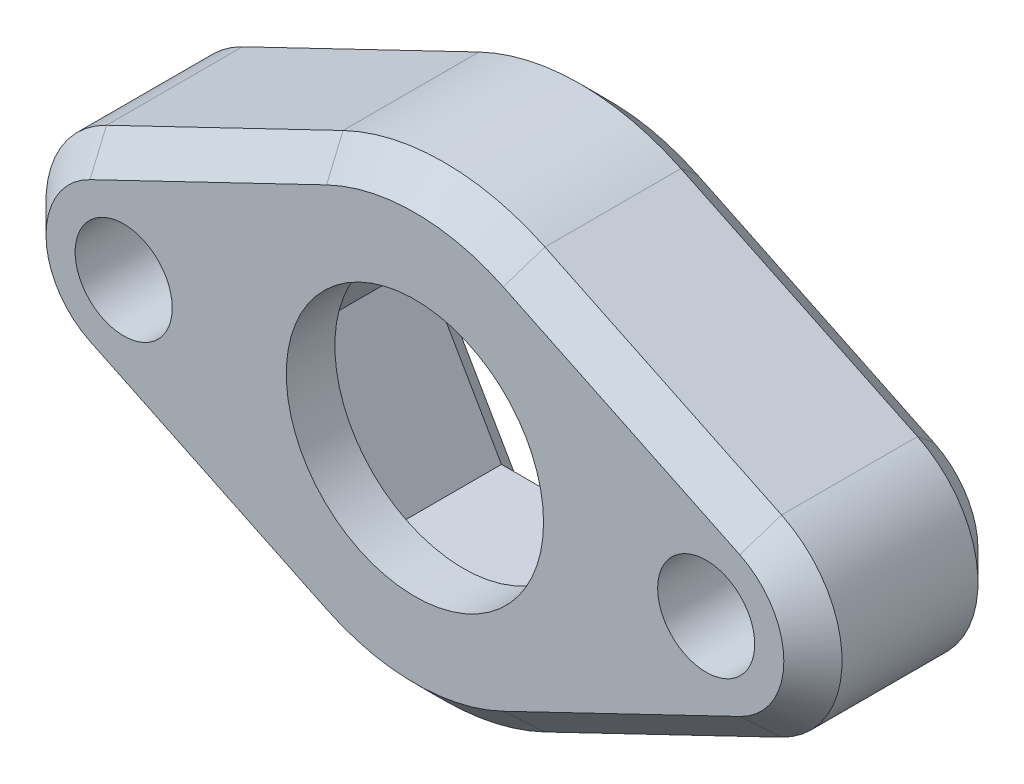
ISO-10303-21;
HEADER;
FILE_DESCRIPTION(('STEP AP214'),'2;1');
FILE_NAME('part.step','',(''),(''),'','','');
FILE_SCHEMA(('AUTOMOTIVE_DESIGN { 1 0 10303 214 1 1 1 1 }'));
ENDSEC;
DATA;
#1=APPLICATION_CONTEXT('core data for automotive mechanical design processes');
#2=APPLICATION_PROTOCOL_DEFINITION('international standard','automotive_design',2000,#1);
#3=PRODUCT_CONTEXT('',#1,'mechanical');
#4=PRODUCT('Part','Part','',(#3));
#5=PRODUCT_RELATED_PRODUCT_CATEGORY('part','',(#4));
#6=PRODUCT_DEFINITION_FORMATION('','',#4);
#7=PRODUCT_DEFINITION_CONTEXT('part definition',#1,'design');
#8=PRODUCT_DEFINITION('design','',#6,#7);
#9=PRODUCT_DEFINITION_SHAPE('','',#8);
#10=(LENGTH_UNIT() NAMED_UNIT(*) SI_UNIT(.MILLI.,.METRE.));
#11=(NAMED_UNIT(*) PLANE_ANGLE_UNIT() SI_UNIT($,.RADIAN.));
#12=(NAMED_UNIT(*) SI_UNIT($,.STERADIAN.) SOLID_ANGLE_UNIT());
#13=UNCERTAINTY_MEASURE_WITH_UNIT(LENGTH_MEASURE(1.E-05),#10,'distance_accuracy_value','');
#14=(GEOMETRIC_REPRESENTATION_CONTEXT(3) GLOBAL_UNCERTAINTY_ASSIGNED_CONTEXT((#13)) GLOBAL_UNIT_ASSIGNED_CONTEXT((#10,
#11,#12)) REPRESENTATION_CONTEXT('',''));
#15=CARTESIAN_POINT('',(0.,0.,0.));
#16=DIRECTION('',(0.,0.,1.));
#17=DIRECTION('',(1.,0.,0.));
#18=AXIS2_PLACEMENT_3D('',#15,#16,#17);
#19=CARTESIAN_POINT('',(4.04145188432738,-7.,10.));
#20=DIRECTION('',(-0.866025403784439,0.5,0.));
#21=DIRECTION('',(-0.5,-0.866025403784439,0.));
#22=AXIS2_PLACEMENT_3D('',#19,#20,#21);
#23=PLANE('',#22);
#24=DIRECTION('',(0.,0.,-1.));
#25=VECTOR('',#24,1.);
#26=CARTESIAN_POINT('',(8.08290376865476,0.,10.));
#27=LINE('',#26,#25);
#28=CARTESIAN_POINT('',(8.08290376865476,0.,7.5));
#29=VERTEX_POINT('',#28);
#30=CARTESIAN_POINT('',(8.08290376865476,0.,1.50000000000001));
#31=VERTEX_POINT('',#30);
#32=EDGE_CURVE('E227',#29,#31,#27,.T.);
#33=ORIENTED_EDGE('',*,*,#32,.T.);
#34=DIRECTION('',(-0.5,-0.866025403784439,0.));
#35=VECTOR('',#34,1.);
#36=CARTESIAN_POINT('',(4.04145188432738,-7.,1.50000000000001));
#37=LINE('',#36,#35);
#38=CARTESIAN_POINT('',(4.04145188432738,-7.,1.50000000000001));
#39=VERTEX_POINT('',#38);
#40=EDGE_CURVE('E356',#31,#39,#37,.T.);
#41=ORIENTED_EDGE('',*,*,#40,.T.);
#42=DIRECTION('',(0.,0.,-1.));
#43=VECTOR('',#42,1.);
#44=CARTESIAN_POINT('',(4.04145188432738,-7.,10.));
#45=LINE('',#44,#43);
#46=CARTESIAN_POINT('',(4.04145188432738,-7.,7.5));
#47=VERTEX_POINT('',#46);
#48=EDGE_CURVE('E229',#47,#39,#45,.T.);
#49=ORIENTED_EDGE('',*,*,#48,.F.);
#50=DIRECTION('',(0.5,0.866025403784439,0.));
#51=VECTOR('',#50,1.);
#52=CARTESIAN_POINT('',(4.04145188432738,-7.,7.5));
#53=LINE('',#52,#51);
#54=EDGE_CURVE('E215',#47,#29,#53,.T.);
#55=ORIENTED_EDGE('',*,*,#54,.T.);
#56=EDGE_LOOP('',(#33,#41,#49,#55));
#57=FACE_BOUND('',#56,.T.);
#58=ADVANCED_FACE('F41',(#57),#23,.T.);
#59=CARTESIAN_POINT('',(8.08290376865476,0.,10.));
#60=DIRECTION('',(-0.866025403784438,-0.5,0.));
#61=DIRECTION('',(0.5,-0.866025403784438,0.));
#62=AXIS2_PLACEMENT_3D('',#59,#60,#61);
#63=PLANE('',#62);
#64=DIRECTION('',(0.,0.,-1.));
#65=VECTOR('',#64,1.);
#66=CARTESIAN_POINT('',(4.04145188432738,7.,10.));
#67=LINE('',#66,#65);
#68=CARTESIAN_POINT('',(4.04145188432738,7.,7.5));
#69=VERTEX_POINT('',#68);
#70=CARTESIAN_POINT('',(4.04145188432738,7.,1.50000000000001));
#71=VERTEX_POINT('',#70);
#72=EDGE_CURVE('E237',#69,#71,#67,.T.);
#73=ORIENTED_EDGE('',*,*,#72,.T.);
#74=DIRECTION('',(0.5,-0.866025403784438,0.));
#75=VECTOR('',#74,1.);
#76=CARTESIAN_POINT('',(8.08290376865476,0.,1.50000000000001));
#77=LINE('',#76,#75);
#78=EDGE_CURVE('E235',#71,#31,#77,.T.);
#79=ORIENTED_EDGE('',*,*,#78,.T.);
#80=ORIENTED_EDGE('',*,*,#32,.F.);
#81=DIRECTION('',(-0.5,0.866025403784438,0.));
#82=VECTOR('',#81,1.);
#83=CARTESIAN_POINT('',(8.08290376865476,0.,7.5));
#84=LINE('',#83,#82);
#85=EDGE_CURVE('E211',#29,#69,#84,.T.);
#86=ORIENTED_EDGE('',*,*,#85,.T.);
#87=EDGE_LOOP('',(#73,#79,#80,#86));
#88=FACE_BOUND('',#87,.T.);
#89=ADVANCED_FACE('F233',(#88),#63,.T.);
#90=CARTESIAN_POINT('',(4.04145188432738,7.,10.));
#91=DIRECTION('',(0.,-1.,0.));
#92=DIRECTION('',(0.,0.,-1.));
#93=AXIS2_PLACEMENT_3D('',#90,#91,#92);
#94=PLANE('',#93);
#95=DIRECTION('',(0.,0.,-1.));
#96=VECTOR('',#95,1.);
#97=CARTESIAN_POINT('',(-4.04145188432738,7.,10.));
#98=LINE('',#97,#96);
#99=CARTESIAN_POINT('',(-4.04145188432738,7.,7.5));
#100=VERTEX_POINT('',#99);
#101=CARTESIAN_POINT('',(-4.04145188432738,7.,1.50000000000001));
#102=VERTEX_POINT('',#101);
#103=EDGE_CURVE('E242',#100,#102,#98,.T.);
#104=ORIENTED_EDGE('',*,*,#103,.T.);
#105=DIRECTION('',(1.,0.,0.));
#106=VECTOR('',#105,1.);
#107=CARTESIAN_POINT('',(4.04145188432738,7.,1.50000000000001));
#108=LINE('',#107,#106);
#109=EDGE_CURVE('E11',#102,#71,#108,.T.);
#110=ORIENTED_EDGE('',*,*,#109,.T.);
#111=ORIENTED_EDGE('',*,*,#72,.F.);
#112=DIRECTION('',(-1.,0.,0.));
#113=VECTOR('',#112,1.);
#114=CARTESIAN_POINT('',(4.04145188432738,7.,7.5));
#115=LINE('',#114,#113);
#116=EDGE_CURVE('E218',#69,#100,#115,.T.);
#117=ORIENTED_EDGE('',*,*,#116,.T.);
#118=EDGE_LOOP('',(#104,#110,#111,#117));
#119=FACE_BOUND('',#118,.T.);
#120=ADVANCED_FACE('F538',(#119),#94,.T.);
#121=CARTESIAN_POINT('',(-4.04145188432738,7.,10.));
#122=DIRECTION('',(0.866025403784439,-0.5,0.));
#123=DIRECTION('',(0.5,0.866025403784439,0.));
#124=AXIS2_PLACEMENT_3D('',#121,#122,#123);
#125=PLANE('',#124);
#126=DIRECTION('',(0.,0.,-1.));
#127=VECTOR('',#126,1.);
#128=CARTESIAN_POINT('',(-8.08290376865476,0.,10.));
#129=LINE('',#128,#127);
#130=CARTESIAN_POINT('',(-8.08290376865476,0.,7.5));
#131=VERTEX_POINT('',#130);
#132=CARTESIAN_POINT('',(-8.08290376865476,0.,1.50000000000001));
#133=VERTEX_POINT('',#132);
#134=EDGE_CURVE('E675',#131,#133,#129,.T.);
#135=ORIENTED_EDGE('',*,*,#134,.T.);
#136=DIRECTION('',(0.5,0.866025403784439,0.));
#137=VECTOR('',#136,1.);
#138=CARTESIAN_POINT('',(-4.04145188432738,7.,1.50000000000001));
#139=LINE('',#138,#137);
#140=EDGE_CURVE('E51',#133,#102,#139,.T.);
#141=ORIENTED_EDGE('',*,*,#140,.T.);
#142=ORIENTED_EDGE('',*,*,#103,.F.);
#143=DIRECTION('',(-0.5,-0.866025403784439,0.));
#144=VECTOR('',#143,1.);
#145=CARTESIAN_POINT('',(-4.04145188432738,7.,7.5));
#146=LINE('',#145,#144);
#147=EDGE_CURVE('E683',#100,#131,#146,.T.);
#148=ORIENTED_EDGE('',*,*,#147,.T.);
#149=EDGE_LOOP('',(#135,#141,#142,#148));
#150=FACE_BOUND('',#149,.T.);
#151=ADVANCED_FACE('F682',(#150),#125,.T.);
#152=CARTESIAN_POINT('',(-8.08290376865476,0.,10.));
#153=DIRECTION('',(0.866025403784438,0.5,0.));
#154=DIRECTION('',(-0.5,0.866025403784438,0.));
#155=AXIS2_PLACEMENT_3D('',#152,#153,#154);
#156=PLANE('',#155);
#157=DIRECTION('',(0.,0.,-1.));
#158=VECTOR('',#157,1.);
#159=CARTESIAN_POINT('',(-4.04145188432738,-7.,10.));
#160=LINE('',#159,#158);
#161=CARTESIAN_POINT('',(-4.04145188432738,-7.,7.5));
#162=VERTEX_POINT('',#161);
#163=CARTESIAN_POINT('',(-4.04145188432738,-7.,1.50000000000001));
#164=VERTEX_POINT('',#163);
#165=EDGE_CURVE('E671',#162,#164,#160,.T.);
#166=ORIENTED_EDGE('',*,*,#165,.T.);
#167=DIRECTION('',(-0.5,0.866025403784438,0.));
#168=VECTOR('',#167,1.);
#169=CARTESIAN_POINT('',(-8.08290376865476,0.,1.50000000000001));
#170=LINE('',#169,#168);
#171=EDGE_CURVE('E66',#164,#133,#170,.T.);
#172=ORIENTED_EDGE('',*,*,#171,.T.);
#173=ORIENTED_EDGE('',*,*,#134,.F.);
#174=DIRECTION('',(0.5,-0.866025403784438,0.));
#175=VECTOR('',#174,1.);
#176=CARTESIAN_POINT('',(-8.08290376865476,0.,7.5));
#177=LINE('',#176,#175);
#178=EDGE_CURVE('E686',#131,#162,#177,.T.);
#179=ORIENTED_EDGE('',*,*,#178,.T.);
#180=EDGE_LOOP('',(#166,#172,#173,#179));
#181=FACE_BOUND('',#180,.T.);
#182=ADVANCED_FACE('F685',(#181),#156,.T.);
#183=CARTESIAN_POINT('',(-4.04145188432738,-7.,10.));
#184=DIRECTION('',(0.,1.,0.));
#185=DIRECTION('',(-1.,0.,0.));
#186=AXIS2_PLACEMENT_3D('',#183,#184,#185);
#187=PLANE('',#186);
#188=ORIENTED_EDGE('',*,*,#48,.T.);
#189=DIRECTION('',(-1.,0.,0.));
#190=VECTOR('',#189,1.);
#191=CARTESIAN_POINT('',(-4.04145188432738,-7.,1.50000000000001));
#192=LINE('',#191,#190);
#193=EDGE_CURVE('E358',#39,#164,#192,.T.);
#194=ORIENTED_EDGE('',*,*,#193,.T.);
#195=ORIENTED_EDGE('',*,*,#165,.F.);
#196=DIRECTION('',(1.,0.,0.));
#197=VECTOR('',#196,1.);
#198=CARTESIAN_POINT('',(-4.04145188432738,-7.,7.5));
#199=LINE('',#198,#197);
#200=EDGE_CURVE('E272',#162,#47,#199,.T.);
#201=ORIENTED_EDGE('',*,*,#200,.T.);
#202=EDGE_LOOP('',(#188,#194,#195,#201));
#203=FACE_BOUND('',#202,.T.);
#204=ADVANCED_FACE('F550',(#203),#187,.T.);
#205=CARTESIAN_POINT('',(0.,0.,10.));
#206=DIRECTION('',(0.,0.,1.));
#207=DIRECTION('',(1.,0.,0.));
#208=AXIS2_PLACEMENT_3D('',#205,#206,#207);
#209=PLANE('',#208);
#210=DIRECTION('',(0.901233722306385,0.433333333333333,0.));
#211=VECTOR('',#210,1.);
#212=CARTESIAN_POINT('',(16.7333333333333,-3.60493488922554,10.));
#213=LINE('',#212,#211);
#214=CARTESIAN_POINT('',(4.55000000000001,-9.46295408421704,10.));
#215=VERTEX_POINT('',#214);
#216=CARTESIAN_POINT('',(16.7333333333333,-3.60493488922554,10.));
#217=VERTEX_POINT('',#216);
#218=EDGE_CURVE('E284',#215,#217,#213,.T.);
#219=ORIENTED_EDGE('',*,*,#218,.T.);
#220=CARTESIAN_POINT('',(15.,0.,10.));
#221=DIRECTION('',(0.,0.,1.));
#222=DIRECTION('',(1.,0.,0.));
#223=AXIS2_PLACEMENT_3D('',#220,#221,#222);
#224=CIRCLE('',#223,4.);
#225=CARTESIAN_POINT('',(16.7333333333333,3.60493488922554,10.));
#226=VERTEX_POINT('',#225);
#227=EDGE_CURVE('E288',#217,#226,#224,.T.);
#228=ORIENTED_EDGE('',*,*,#227,.T.);
#229=DIRECTION('',(-0.901233722306385,0.433333333333333,0.));
#230=VECTOR('',#229,1.);
#231=CARTESIAN_POINT('',(4.55,9.46295408421704,10.));
#232=LINE('',#231,#230);
#233=CARTESIAN_POINT('',(4.55,9.46295408421704,10.));
#234=VERTEX_POINT('',#233);
#235=EDGE_CURVE('E286',#226,#234,#232,.T.);
#236=ORIENTED_EDGE('',*,*,#235,.T.);
#237=CARTESIAN_POINT('',(0.,0.,10.));
#238=DIRECTION('',(0.,0.,1.));
#239=DIRECTION('',(1.,0.,0.));
#240=AXIS2_PLACEMENT_3D('',#237,#238,#239);
#241=CIRCLE('',#240,10.5);
#242=CARTESIAN_POINT('',(-4.55,9.46295408421704,10.));
#243=VERTEX_POINT('',#242);
#244=EDGE_CURVE('E282',#234,#243,#241,.T.);
#245=ORIENTED_EDGE('',*,*,#244,.T.);
#246=DIRECTION('',(-0.901233722306385,-0.433333333333333,0.));
#247=VECTOR('',#246,1.);
#248=CARTESIAN_POINT('',(-16.7333333333333,3.60493488922554,10.));
#249=LINE('',#248,#247);
#250=CARTESIAN_POINT('',(-16.7333333333333,3.60493488922554,10.));
#251=VERTEX_POINT('',#250);
#252=EDGE_CURVE('E278',#243,#251,#249,.T.);
#253=ORIENTED_EDGE('',*,*,#252,.T.);
#254=CARTESIAN_POINT('',(-15.,0.,10.));
#255=DIRECTION('',(0.,0.,1.));
#256=DIRECTION('',(1.,0.,0.));
#257=AXIS2_PLACEMENT_3D('',#254,#255,#256);
#258=CIRCLE('',#257,4.);
#259=CARTESIAN_POINT('',(-16.7333333333333,-3.60493488922554,10.));
#260=VERTEX_POINT('',#259);
#261=EDGE_CURVE('E274',#251,#260,#258,.T.);
#262=ORIENTED_EDGE('',*,*,#261,.T.);
#263=DIRECTION('',(0.901233722306385,-0.433333333333333,0.));
#264=VECTOR('',#263,1.);
#265=CARTESIAN_POINT('',(-4.55,-9.46295408421704,10.));
#266=LINE('',#265,#264);
#267=CARTESIAN_POINT('',(-4.55,-9.46295408421704,10.));
#268=VERTEX_POINT('',#267);
#269=EDGE_CURVE('E276',#260,#268,#266,.T.);
#270=ORIENTED_EDGE('',*,*,#269,.T.);
#271=CARTESIAN_POINT('',(0.,0.,10.));
#272=DIRECTION('',(0.,0.,1.));
#273=DIRECTION('',(1.,0.,0.));
#274=AXIS2_PLACEMENT_3D('',#271,#272,#273);
#275=CIRCLE('',#274,10.5);
#276=EDGE_CURVE('E280',#268,#215,#275,.T.);
#277=ORIENTED_EDGE('',*,*,#276,.T.);
#278=EDGE_LOOP('',(#219,#228,#236,#245,#253,#262,#270,#277));
#279=FACE_BOUND('',#278,.T.);
#280=CARTESIAN_POINT('',(-15.,0.,10.));
#281=DIRECTION('',(0.,0.,1.));
#282=DIRECTION('',(1.,0.,0.));
#283=AXIS2_PLACEMENT_3D('',#280,#281,#282);
#284=CIRCLE('',#283,2.5);
#285=CARTESIAN_POINT('',(-12.5,0.,10.));
#286=VERTEX_POINT('',#285);
#287=EDGE_CURVE('E240',#286,#286,#284,.T.);
#288=ORIENTED_EDGE('',*,*,#287,.F.);
#289=EDGE_LOOP('',(#288));
#290=FACE_BOUND('',#289,.T.);
#291=CARTESIAN_POINT('',(15.,0.,10.));
#292=DIRECTION('',(0.,0.,1.));
#293=DIRECTION('',(-1.,0.,0.));
#294=AXIS2_PLACEMENT_3D('',#291,#292,#293);
#295=CIRCLE('',#294,2.5);
#296=CARTESIAN_POINT('',(12.5,0.,10.));
#297=VERTEX_POINT('',#296);
#298=EDGE_CURVE('E672',#297,#297,#295,.T.);
#299=ORIENTED_EDGE('',*,*,#298,.F.);
#300=EDGE_LOOP('',(#299));
#301=FACE_BOUND('',#300,.T.);
#302=CARTESIAN_POINT('',(0.,0.,10.));
#303=DIRECTION('',(0.,0.,1.));
#304=DIRECTION('',(1.,0.,0.));
#305=AXIS2_PLACEMENT_3D('',#302,#303,#304);
#306=CIRCLE('',#305,6.625);
#307=CARTESIAN_POINT('',(6.625,0.,10.));
#308=VERTEX_POINT('',#307);
#309=EDGE_CURVE('E385',#308,#308,#306,.T.);
#310=ORIENTED_EDGE('',*,*,#309,.F.);
#311=EDGE_LOOP('',(#310));
#312=FACE_BOUND('',#311,.T.);
#313=ADVANCED_FACE('F547',(#279,#290,#301,#312),#209,.T.);
#314=CARTESIAN_POINT('',(0.,0.,0.));
#315=DIRECTION('',(0.,0.,1.));
#316=DIRECTION('',(1.,0.,0.));
#317=AXIS2_PLACEMENT_3D('',#314,#315,#316);
#318=PLANE('',#317);
#319=DIRECTION('',(0.5,0.866025403784439,0.));
#320=VECTOR('',#319,1.);
#321=CARTESIAN_POINT('',(9.38194187433142,-0.750000000000001,0.));
#322=LINE('',#321,#320);
#323=CARTESIAN_POINT('',(4.90747728811182,-8.5,0.));
#324=VERTEX_POINT('',#323);
#325=CARTESIAN_POINT('',(9.81495457622364,0.,0.));
#326=VERTEX_POINT('',#325);
#327=EDGE_CURVE('E350',#324,#326,#322,.T.);
#328=ORIENTED_EDGE('',*,*,#327,.T.);
#329=DIRECTION('',(-0.5,0.866025403784438,0.));
#330=VECTOR('',#329,1.);
#331=CARTESIAN_POINT('',(5.34048999000404,7.75,0.));
#332=LINE('',#331,#330);
#333=CARTESIAN_POINT('',(4.90747728811182,8.5,0.));
#334=VERTEX_POINT('',#333);
#335=EDGE_CURVE('E352',#326,#334,#332,.T.);
#336=ORIENTED_EDGE('',*,*,#335,.T.);
#337=DIRECTION('',(-1.,0.,0.));
#338=VECTOR('',#337,1.);
#339=CARTESIAN_POINT('',(-4.04145188432738,8.5,0.));
#340=LINE('',#339,#338);
#341=CARTESIAN_POINT('',(-4.90747728811182,8.5,0.));
#342=VERTEX_POINT('',#341);
#343=EDGE_CURVE('E342',#334,#342,#340,.T.);
#344=ORIENTED_EDGE('',*,*,#343,.T.);
#345=DIRECTION('',(-0.5,-0.866025403784439,0.));
#346=VECTOR('',#345,1.);
#347=CARTESIAN_POINT('',(-9.38194187433142,0.750000000000003,0.));
#348=LINE('',#347,#346);
#349=CARTESIAN_POINT('',(-9.81495457622364,0.,0.));
#350=VERTEX_POINT('',#349);
#351=EDGE_CURVE('E344',#342,#350,#348,.T.);
#352=ORIENTED_EDGE('',*,*,#351,.T.);
#353=DIRECTION('',(0.5,-0.866025403784439,0.));
#354=VECTOR('',#353,1.);
#355=CARTESIAN_POINT('',(-5.34048999000404,-7.75,0.));
#356=LINE('',#355,#354);
#357=CARTESIAN_POINT('',(-4.90747728811182,-8.5,0.));
#358=VERTEX_POINT('',#357);
#359=EDGE_CURVE('E346',#350,#358,#356,.T.);
#360=ORIENTED_EDGE('',*,*,#359,.T.);
#361=DIRECTION('',(1.,0.,0.));
#362=VECTOR('',#361,1.);
#363=CARTESIAN_POINT('',(4.04145188432738,-8.5,0.));
#364=LINE('',#363,#362);
#365=EDGE_CURVE('E348',#358,#324,#364,.T.);
#366=ORIENTED_EDGE('',*,*,#365,.T.);
#367=EDGE_LOOP('',(#328,#336,#344,#352,#360,#366));
#368=FACE_BOUND('',#367,.T.);
#369=DIRECTION('',(0.901233722306385,0.433333333333333,0.));
#370=VECTOR('',#369,1.);
#371=CARTESIAN_POINT('',(-4.54999999999999,9.46295408421704,0.));
#372=LINE('',#371,#370);
#373=CARTESIAN_POINT('',(-16.7333333333333,3.60493488922553,0.));
#374=VERTEX_POINT('',#373);
#375=CARTESIAN_POINT('',(-4.55,9.46295408421703,0.));
#376=VERTEX_POINT('',#375);
#377=EDGE_CURVE('E337',#374,#376,#372,.T.);
#378=ORIENTED_EDGE('',*,*,#377,.T.);
#379=CARTESIAN_POINT('',(0.,0.,0.));
#380=DIRECTION('',(0.,0.,1.));
#381=DIRECTION('',(1.,0.,0.));
#382=AXIS2_PLACEMENT_3D('',#379,#380,#381);
#383=CIRCLE('',#382,10.5);
#384=CARTESIAN_POINT('',(4.55,9.46295408421704,0.));
#385=VERTEX_POINT('',#384);
#386=EDGE_CURVE('E339',#376,#385,#383,.F.);
#387=ORIENTED_EDGE('',*,*,#386,.T.);
#388=DIRECTION('',(0.901233722306385,-0.433333333333333,0.));
#389=VECTOR('',#388,1.);
#390=CARTESIAN_POINT('',(4.54999999999999,9.46295408421704,0.));
#391=LINE('',#390,#389);
#392=CARTESIAN_POINT('',(16.7333333333333,3.60493488922554,0.));
#393=VERTEX_POINT('',#392);
#394=EDGE_CURVE('E335',#385,#393,#391,.T.);
#395=ORIENTED_EDGE('',*,*,#394,.T.);
#396=CARTESIAN_POINT('',(15.,0.,0.));
#397=DIRECTION('',(0.,0.,1.));
#398=DIRECTION('',(1.,0.,0.));
#399=AXIS2_PLACEMENT_3D('',#396,#397,#398);
#400=CIRCLE('',#399,4.);
#401=CARTESIAN_POINT('',(16.7333333333333,-3.60493488922553,0.));
#402=VERTEX_POINT('',#401);
#403=EDGE_CURVE('E331',#393,#402,#400,.F.);
#404=ORIENTED_EDGE('',*,*,#403,.T.);
#405=DIRECTION('',(-0.901233722306385,-0.433333333333333,0.));
#406=VECTOR('',#405,1.);
#407=CARTESIAN_POINT('',(4.55,-9.46295408421704,0.));
#408=LINE('',#407,#406);
#409=CARTESIAN_POINT('',(4.55,-9.46295408421703,0.));
#410=VERTEX_POINT('',#409);
#411=EDGE_CURVE('E327',#402,#410,#408,.T.);
#412=ORIENTED_EDGE('',*,*,#411,.T.);
#413=CARTESIAN_POINT('',(0.,0.,0.));
#414=DIRECTION('',(0.,0.,1.));
#415=DIRECTION('',(1.,0.,0.));
#416=AXIS2_PLACEMENT_3D('',#413,#414,#415);
#417=CIRCLE('',#416,10.5);
#418=CARTESIAN_POINT('',(-4.55,-9.46295408421704,0.));
#419=VERTEX_POINT('',#418);
#420=EDGE_CURVE('E325',#410,#419,#417,.F.);
#421=ORIENTED_EDGE('',*,*,#420,.T.);
#422=DIRECTION('',(-0.901233722306385,0.433333333333333,0.));
#423=VECTOR('',#422,1.);
#424=CARTESIAN_POINT('',(-4.55,-9.46295408421704,0.));
#425=LINE('',#424,#423);
#426=CARTESIAN_POINT('',(-16.7333333333333,-3.60493488922554,0.));
#427=VERTEX_POINT('',#426);
#428=EDGE_CURVE('E329',#419,#427,#425,.T.);
#429=ORIENTED_EDGE('',*,*,#428,.T.);
#430=CARTESIAN_POINT('',(-15.,0.,0.));
#431=DIRECTION('',(0.,0.,1.));
#432=DIRECTION('',(1.,0.,0.));
#433=AXIS2_PLACEMENT_3D('',#430,#431,#432);
#434=CIRCLE('',#433,3.99999999999999);
#435=EDGE_CURVE('E333',#427,#374,#434,.F.);
#436=ORIENTED_EDGE('',*,*,#435,.T.);
#437=EDGE_LOOP('',(#378,#387,#395,#404,#412,#421,#429,#436));
#438=FACE_BOUND('',#437,.T.);
#439=CARTESIAN_POINT('',(-15.,0.,0.));
#440=DIRECTION('',(0.,0.,1.));
#441=DIRECTION('',(1.,0.,0.));
#442=AXIS2_PLACEMENT_3D('',#439,#440,#441);
#443=CIRCLE('',#442,2.5);
#444=CARTESIAN_POINT('',(-12.5,0.,0.));
#445=VERTEX_POINT('',#444);
#446=EDGE_CURVE('E236',#445,#445,#443,.T.);
#447=ORIENTED_EDGE('',*,*,#446,.T.);
#448=EDGE_LOOP('',(#447));
#449=FACE_BOUND('',#448,.T.);
#450=CARTESIAN_POINT('',(15.,0.,0.));
#451=DIRECTION('',(0.,0.,1.));
#452=DIRECTION('',(-1.,0.,0.));
#453=AXIS2_PLACEMENT_3D('',#450,#451,#452);
#454=CIRCLE('',#453,2.5);
#455=CARTESIAN_POINT('',(12.5,0.,0.));
#456=VERTEX_POINT('',#455);
#457=EDGE_CURVE('E230',#456,#456,#454,.T.);
#458=ORIENTED_EDGE('',*,*,#457,.T.);
#459=EDGE_LOOP('',(#458));
#460=FACE_BOUND('',#459,.T.);
#461=ADVANCED_FACE('F433',(#368,#438,#449,#460),#318,.F.);
#462=CARTESIAN_POINT('',(0.,0.,10.));
#463=DIRECTION('',(0.,0.,-1.));
#464=DIRECTION('',(-1.,0.,0.));
#465=AXIS2_PLACEMENT_3D('',#462,#463,#464);
#466=CYLINDRICAL_SURFACE('',#465,12.);
#467=DIRECTION('',(0.,0.,-1.));
#468=VECTOR('',#467,1.);
#469=CARTESIAN_POINT('',(5.2,-10.8148046676766,10.));
#470=LINE('',#469,#468);
#471=CARTESIAN_POINT('',(5.2,-10.8148046676766,8.49999999999999));
#472=VERTEX_POINT('',#471);
#473=CARTESIAN_POINT('',(5.2,-10.8148046676766,1.5));
#474=VERTEX_POINT('',#473);
#475=EDGE_CURVE('E269',#472,#474,#470,.T.);
#476=ORIENTED_EDGE('',*,*,#475,.F.);
#477=CARTESIAN_POINT('',(0.,0.,8.49999999999999));
#478=DIRECTION('',(0.,0.,1.));
#479=DIRECTION('',(1.,0.,0.));
#480=AXIS2_PLACEMENT_3D('',#477,#478,#479);
#481=CIRCLE('',#480,12.);
#482=CARTESIAN_POINT('',(-5.2,-10.8148046676766,8.49999999999999));
#483=VERTEX_POINT('',#482);
#484=EDGE_CURVE('E311',#472,#483,#481,.F.);
#485=ORIENTED_EDGE('',*,*,#484,.T.);
#486=DIRECTION('',(0.,0.,-1.));
#487=VECTOR('',#486,1.);
#488=CARTESIAN_POINT('',(-5.2,-10.8148046676766,10.));
#489=LINE('',#488,#487);
#490=CARTESIAN_POINT('',(-5.2,-10.8148046676766,1.5));
#491=VERTEX_POINT('',#490);
#492=EDGE_CURVE('E247',#483,#491,#489,.T.);
#493=ORIENTED_EDGE('',*,*,#492,.T.);
#494=CARTESIAN_POINT('',(0.,0.,1.5));
#495=DIRECTION('',(0.,0.,1.));
#496=DIRECTION('',(1.,0.,0.));
#497=AXIS2_PLACEMENT_3D('',#494,#495,#496);
#498=CIRCLE('',#497,12.);
#499=EDGE_CURVE('E309',#491,#474,#498,.T.);
#500=ORIENTED_EDGE('',*,*,#499,.T.);
#501=EDGE_LOOP('',(#476,#485,#493,#500));
#502=FACE_BOUND('',#501,.T.);
#503=ADVANCED_FACE('F483',(#502),#466,.T.);
#504=CARTESIAN_POINT('',(5.2,-10.8148046676766,10.));
#505=DIRECTION('',(-0.433333333333333,0.901233722306385,0.));
#506=DIRECTION('',(-0.901233722306385,-0.433333333333333,0.));
#507=AXIS2_PLACEMENT_3D('',#504,#505,#506);
#508=PLANE('',#507);
#509=DIRECTION('',(0.,0.,-1.));
#510=VECTOR('',#509,1.);
#511=CARTESIAN_POINT('',(17.3833333333333,-4.95678547268512,10.));
#512=LINE('',#511,#510);
#513=CARTESIAN_POINT('',(17.3833333333333,-4.95678547268512,8.49999999999999));
#514=VERTEX_POINT('',#513);
#515=CARTESIAN_POINT('',(17.3833333333333,-4.95678547268512,1.5));
#516=VERTEX_POINT('',#515);
#517=EDGE_CURVE('E266',#514,#516,#512,.T.);
#518=ORIENTED_EDGE('',*,*,#517,.F.);
#519=DIRECTION('',(-0.901233722306385,-0.433333333333333,0.));
#520=VECTOR('',#519,1.);
#521=CARTESIAN_POINT('',(5.20000000000001,-10.8148046676766,8.49999999999999));
#522=LINE('',#521,#520);
#523=EDGE_CURVE('E302',#514,#472,#522,.T.);
#524=ORIENTED_EDGE('',*,*,#523,.T.);
#525=ORIENTED_EDGE('',*,*,#475,.T.);
#526=DIRECTION('',(0.901233722306385,0.433333333333333,0.));
#527=VECTOR('',#526,1.);
#528=CARTESIAN_POINT('',(5.2,-10.8148046676766,1.5));
#529=LINE('',#528,#527);
#530=EDGE_CURVE('E300',#474,#516,#529,.T.);
#531=ORIENTED_EDGE('',*,*,#530,.T.);
#532=EDGE_LOOP('',(#518,#524,#525,#531));
#533=FACE_BOUND('',#532,.T.);
#534=ADVANCED_FACE('F480',(#533),#508,.F.);
#535=CARTESIAN_POINT('',(15.,0.,10.));
#536=DIRECTION('',(0.,0.,-1.));
#537=DIRECTION('',(-1.,0.,0.));
#538=AXIS2_PLACEMENT_3D('',#535,#536,#537);
#539=CYLINDRICAL_SURFACE('',#538,5.5);
#540=DIRECTION('',(0.,0.,-1.));
#541=VECTOR('',#540,1.);
#542=CARTESIAN_POINT('',(17.3833333333333,4.95678547268512,10.));
#543=LINE('',#542,#541);
#544=CARTESIAN_POINT('',(17.3833333333333,4.95678547268512,8.49999999999999));
#545=VERTEX_POINT('',#544);
#546=CARTESIAN_POINT('',(17.3833333333333,4.95678547268512,1.5));
#547=VERTEX_POINT('',#546);
#548=EDGE_CURVE('E263',#545,#547,#543,.T.);
#549=ORIENTED_EDGE('',*,*,#548,.F.);
#550=CARTESIAN_POINT('',(15.,0.,8.49999999999999));
#551=DIRECTION('',(0.,0.,1.));
#552=DIRECTION('',(1.,0.,0.));
#553=AXIS2_PLACEMENT_3D('',#550,#551,#552);
#554=CIRCLE('',#553,5.5);
#555=EDGE_CURVE('E293',#545,#514,#554,.F.);
#556=ORIENTED_EDGE('',*,*,#555,.T.);
#557=ORIENTED_EDGE('',*,*,#517,.T.);
#558=CARTESIAN_POINT('',(15.,0.,1.5));
#559=DIRECTION('',(0.,0.,1.));
#560=DIRECTION('',(1.,0.,0.));
#561=AXIS2_PLACEMENT_3D('',#558,#559,#560);
#562=CIRCLE('',#561,5.5);
#563=EDGE_CURVE('E291',#516,#547,#562,.T.);
#564=ORIENTED_EDGE('',*,*,#563,.T.);
#565=EDGE_LOOP('',(#549,#556,#557,#564));
#566=FACE_BOUND('',#565,.T.);
#567=ADVANCED_FACE('F467',(#566),#539,.T.);
#568=CARTESIAN_POINT('',(5.2,10.8148046676766,10.));
#569=DIRECTION('',(-0.433333333333333,-0.901233722306385,0.));
#570=DIRECTION('',(0.901233722306385,-0.433333333333333,0.));
#571=AXIS2_PLACEMENT_3D('',#568,#569,#570);
#572=PLANE('',#571);
#573=DIRECTION('',(0.,0.,-1.));
#574=VECTOR('',#573,1.);
#575=CARTESIAN_POINT('',(5.2,10.8148046676766,10.));
#576=LINE('',#575,#574);
#577=CARTESIAN_POINT('',(5.2,10.8148046676766,8.49999999999999));
#578=VERTEX_POINT('',#577);
#579=CARTESIAN_POINT('',(5.2,10.8148046676766,1.5));
#580=VERTEX_POINT('',#579);
#581=EDGE_CURVE('E260',#578,#580,#576,.T.);
#582=ORIENTED_EDGE('',*,*,#581,.F.);
#583=DIRECTION('',(0.901233722306385,-0.433333333333333,0.));
#584=VECTOR('',#583,1.);
#585=CARTESIAN_POINT('',(17.3833333333333,4.95678547268512,8.49999999999999));
#586=LINE('',#585,#584);
#587=EDGE_CURVE('E298',#578,#545,#586,.T.);
#588=ORIENTED_EDGE('',*,*,#587,.T.);
#589=ORIENTED_EDGE('',*,*,#548,.T.);
#590=DIRECTION('',(-0.901233722306385,0.433333333333333,0.));
#591=VECTOR('',#590,1.);
#592=CARTESIAN_POINT('',(5.2,10.8148046676766,1.5));
#593=LINE('',#592,#591);
#594=EDGE_CURVE('E296',#547,#580,#593,.T.);
#595=ORIENTED_EDGE('',*,*,#594,.T.);
#596=EDGE_LOOP('',(#582,#588,#589,#595));
#597=FACE_BOUND('',#596,.T.);
#598=ADVANCED_FACE('F449',(#597),#572,.F.);
#599=CARTESIAN_POINT('',(0.,0.,10.));
#600=DIRECTION('',(0.,0.,-1.));
#601=DIRECTION('',(-1.,0.,0.));
#602=AXIS2_PLACEMENT_3D('',#599,#600,#601);
#603=CYLINDRICAL_SURFACE('',#602,12.);
#604=DIRECTION('',(0.,0.,-1.));
#605=VECTOR('',#604,1.);
#606=CARTESIAN_POINT('',(-5.2,10.8148046676766,10.));
#607=LINE('',#606,#605);
#608=CARTESIAN_POINT('',(-5.2,10.8148046676766,8.49999999999999));
#609=VERTEX_POINT('',#608);
#610=CARTESIAN_POINT('',(-5.2,10.8148046676766,1.5));
#611=VERTEX_POINT('',#610);
#612=EDGE_CURVE('E257',#609,#611,#607,.T.);
#613=ORIENTED_EDGE('',*,*,#612,.F.);
#614=CARTESIAN_POINT('',(0.,0.,8.49999999999999));
#615=DIRECTION('',(0.,0.,1.));
#616=DIRECTION('',(1.,0.,0.));
#617=AXIS2_PLACEMENT_3D('',#614,#615,#616);
#618=CIRCLE('',#617,12.);
#619=EDGE_CURVE('E307',#609,#578,#618,.F.);
#620=ORIENTED_EDGE('',*,*,#619,.T.);
#621=ORIENTED_EDGE('',*,*,#581,.T.);
#622=CARTESIAN_POINT('',(0.,0.,1.5));
#623=DIRECTION('',(0.,0.,1.));
#624=DIRECTION('',(1.,0.,0.));
#625=AXIS2_PLACEMENT_3D('',#622,#623,#624);
#626=CIRCLE('',#625,12.);
#627=EDGE_CURVE('E304',#580,#611,#626,.T.);
#628=ORIENTED_EDGE('',*,*,#627,.T.);
#629=EDGE_LOOP('',(#613,#620,#621,#628));
#630=FACE_BOUND('',#629,.T.);
#631=ADVANCED_FACE('F454',(#630),#603,.T.);
#632=CARTESIAN_POINT('',(-5.2,10.8148046676766,10.));
#633=DIRECTION('',(0.433333333333333,-0.901233722306385,0.));
#634=DIRECTION('',(0.901233722306385,0.433333333333333,0.));
#635=AXIS2_PLACEMENT_3D('',#632,#633,#634);
#636=PLANE('',#635);
#637=DIRECTION('',(0.,0.,-1.));
#638=VECTOR('',#637,1.);
#639=CARTESIAN_POINT('',(-17.3833333333333,4.95678547268512,10.));
#640=LINE('',#639,#638);
#641=CARTESIAN_POINT('',(-17.3833333333333,4.95678547268512,8.49999999999999));
#642=VERTEX_POINT('',#641);
#643=CARTESIAN_POINT('',(-17.3833333333333,4.95678547268512,1.5));
#644=VERTEX_POINT('',#643);
#645=EDGE_CURVE('E254',#642,#644,#640,.T.);
#646=ORIENTED_EDGE('',*,*,#645,.F.);
#647=DIRECTION('',(0.901233722306385,0.433333333333333,0.));
#648=VECTOR('',#647,1.);
#649=CARTESIAN_POINT('',(-5.2,10.8148046676766,8.49999999999999));
#650=LINE('',#649,#648);
#651=EDGE_CURVE('E315',#642,#609,#650,.T.);
#652=ORIENTED_EDGE('',*,*,#651,.T.);
#653=ORIENTED_EDGE('',*,*,#612,.T.);
#654=DIRECTION('',(-0.901233722306385,-0.433333333333333,0.));
#655=VECTOR('',#654,1.);
#656=CARTESIAN_POINT('',(-5.2,10.8148046676766,1.5));
#657=LINE('',#656,#655);
#658=EDGE_CURVE('E313',#611,#644,#657,.T.);
#659=ORIENTED_EDGE('',*,*,#658,.T.);
#660=EDGE_LOOP('',(#646,#652,#653,#659));
#661=FACE_BOUND('',#660,.T.);
#662=ADVANCED_FACE('F511',(#661),#636,.F.);
#663=CARTESIAN_POINT('',(-15.,0.,10.));
#664=DIRECTION('',(0.,0.,-1.));
#665=DIRECTION('',(-1.,0.,0.));
#666=AXIS2_PLACEMENT_3D('',#663,#664,#665);
#667=CYLINDRICAL_SURFACE('',#666,5.5);
#668=DIRECTION('',(0.,0.,-1.));
#669=VECTOR('',#668,1.);
#670=CARTESIAN_POINT('',(-17.3833333333333,-4.95678547268512,10.));
#671=LINE('',#670,#669);
#672=CARTESIAN_POINT('',(-17.3833333333333,-4.95678547268512,8.49999999999999));
#673=VERTEX_POINT('',#672);
#674=CARTESIAN_POINT('',(-17.3833333333333,-4.95678547268512,1.5));
#675=VERTEX_POINT('',#674);
#676=EDGE_CURVE('E251',#673,#675,#671,.T.);
#677=ORIENTED_EDGE('',*,*,#676,.F.);
#678=CARTESIAN_POINT('',(-15.,0.,8.49999999999999));
#679=DIRECTION('',(0.,0.,1.));
#680=DIRECTION('',(1.,0.,0.));
#681=AXIS2_PLACEMENT_3D('',#678,#679,#680);
#682=CIRCLE('',#681,5.5);
#683=EDGE_CURVE('E323',#673,#642,#682,.F.);
#684=ORIENTED_EDGE('',*,*,#683,.T.);
#685=ORIENTED_EDGE('',*,*,#645,.T.);
#686=CARTESIAN_POINT('',(-15.,0.,1.5));
#687=DIRECTION('',(0.,0.,1.));
#688=DIRECTION('',(1.,0.,0.));
#689=AXIS2_PLACEMENT_3D('',#686,#687,#688);
#690=CIRCLE('',#689,5.5);
#691=EDGE_CURVE('E321',#644,#675,#690,.T.);
#692=ORIENTED_EDGE('',*,*,#691,.T.);
#693=EDGE_LOOP('',(#677,#684,#685,#692));
#694=FACE_BOUND('',#693,.T.);
#695=ADVANCED_FACE('F499',(#694),#667,.T.);
#696=CARTESIAN_POINT('',(-5.2,-10.8148046676766,10.));
#697=DIRECTION('',(0.433333333333333,0.901233722306385,0.));
#698=DIRECTION('',(-0.901233722306385,0.433333333333333,0.));
#699=AXIS2_PLACEMENT_3D('',#696,#697,#698);
#700=PLANE('',#699);
#701=ORIENTED_EDGE('',*,*,#492,.F.);
#702=DIRECTION('',(-0.901233722306385,0.433333333333333,0.));
#703=VECTOR('',#702,1.);
#704=CARTESIAN_POINT('',(-17.3833333333333,-4.95678547268512,8.49999999999999));
#705=LINE('',#704,#703);
#706=EDGE_CURVE('E319',#483,#673,#705,.T.);
#707=ORIENTED_EDGE('',*,*,#706,.T.);
#708=ORIENTED_EDGE('',*,*,#676,.T.);
#709=DIRECTION('',(0.901233722306385,-0.433333333333333,0.));
#710=VECTOR('',#709,1.);
#711=CARTESIAN_POINT('',(-5.2,-10.8148046676766,1.5));
#712=LINE('',#711,#710);
#713=EDGE_CURVE('E317',#675,#491,#712,.T.);
#714=ORIENTED_EDGE('',*,*,#713,.T.);
#715=EDGE_LOOP('',(#701,#707,#708,#714));
#716=FACE_BOUND('',#715,.T.);
#717=ADVANCED_FACE('F496',(#716),#700,.F.);
#718=CARTESIAN_POINT('',(-15.,0.,10.));
#719=DIRECTION('',(0.,0.,-1.));
#720=DIRECTION('',(-1.,0.,0.));
#721=AXIS2_PLACEMENT_3D('',#718,#719,#720);
#722=CYLINDRICAL_SURFACE('',#721,2.5);
#723=ORIENTED_EDGE('',*,*,#287,.T.);
#724=EDGE_LOOP('',(#723));
#725=FACE_BOUND('',#724,.T.);
#726=ORIENTED_EDGE('',*,*,#446,.F.);
#727=EDGE_LOOP('',(#726));
#728=FACE_BOUND('',#727,.T.);
#729=ADVANCED_FACE('F542',(#725,#728),#722,.F.);
#730=CARTESIAN_POINT('',(15.,0.,10.));
#731=DIRECTION('',(0.,0.,-1.));
#732=DIRECTION('',(-1.,0.,0.));
#733=AXIS2_PLACEMENT_3D('',#730,#731,#732);
#734=CYLINDRICAL_SURFACE('',#733,2.5);
#735=ORIENTED_EDGE('',*,*,#298,.T.);
#736=EDGE_LOOP('',(#735));
#737=FACE_BOUND('',#736,.T.);
#738=ORIENTED_EDGE('',*,*,#457,.F.);
#739=EDGE_LOOP('',(#738));
#740=FACE_BOUND('',#739,.T.);
#741=ADVANCED_FACE('F545',(#737,#740),#734,.F.);
#742=CARTESIAN_POINT('',(0.,0.,7.5));
#743=DIRECTION('',(0.,0.,1.));
#744=DIRECTION('',(1.,0.,0.));
#745=AXIS2_PLACEMENT_3D('',#742,#743,#744);
#746=PLANE('',#745);
#747=ORIENTED_EDGE('',*,*,#54,.F.);
#748=ORIENTED_EDGE('',*,*,#200,.F.);
#749=ORIENTED_EDGE('',*,*,#178,.F.);
#750=ORIENTED_EDGE('',*,*,#147,.F.);
#751=ORIENTED_EDGE('',*,*,#116,.F.);
#752=ORIENTED_EDGE('',*,*,#85,.F.);
#753=EDGE_LOOP('',(#747,#748,#749,#750,#751,#752));
#754=FACE_BOUND('',#753,.T.);
#755=CARTESIAN_POINT('',(0.,0.,7.5));
#756=DIRECTION('',(0.,0.,1.));
#757=DIRECTION('',(1.,0.,0.));
#758=AXIS2_PLACEMENT_3D('',#755,#756,#757);
#759=CIRCLE('',#758,6.625);
#760=CARTESIAN_POINT('',(6.625,0.,7.5));
#761=VERTEX_POINT('',#760);
#762=EDGE_CURVE('E687',#761,#761,#759,.T.);
#763=ORIENTED_EDGE('',*,*,#762,.T.);
#764=EDGE_LOOP('',(#763));
#765=FACE_BOUND('',#764,.T.);
#766=ADVANCED_FACE('F213',(#754,#765),#746,.F.);
#767=CARTESIAN_POINT('',(0.,0.,7.5));
#768=DIRECTION('',(0.,0.,1.));
#769=DIRECTION('',(1.,0.,0.));
#770=AXIS2_PLACEMENT_3D('',#767,#768,#769);
#771=CYLINDRICAL_SURFACE('',#770,6.625);
#772=ORIENTED_EDGE('',*,*,#762,.F.);
#773=EDGE_LOOP('',(#772));
#774=FACE_BOUND('',#773,.T.);
#775=ORIENTED_EDGE('',*,*,#309,.T.);
#776=EDGE_LOOP('',(#775));
#777=FACE_BOUND('',#776,.T.);
#778=ADVANCED_FACE('F613',(#774,#777),#771,.F.);
#779=CARTESIAN_POINT('',(-15.,0.,10.));
#780=DIRECTION('',(0.,0.,-1.));
#781=DIRECTION('',(-1.,0.,0.));
#782=AXIS2_PLACEMENT_3D('',#779,#780,#781);
#783=CONICAL_SURFACE('',#782,4.,0.785398163397447);
#784=DIRECTION('',(0.30641293851417,-0.637268476476838,0.707106781186549));
#785=VECTOR('',#784,1.);
#786=CARTESIAN_POINT('',(-17.3833333333333,4.95678547268512,8.49999999999999));
#787=LINE('',#786,#785);
#788=EDGE_CURVE('E379',#642,#251,#787,.T.);
#789=ORIENTED_EDGE('',*,*,#788,.F.);
#790=ORIENTED_EDGE('',*,*,#683,.F.);
#791=DIRECTION('',(-0.30641293851417,-0.637268476476838,-0.707106781186549));
#792=VECTOR('',#791,1.);
#793=CARTESIAN_POINT('',(-16.7333333333333,-3.60493488922554,10.));
#794=LINE('',#793,#792);
#795=EDGE_CURVE('E382',#260,#673,#794,.T.);
#796=ORIENTED_EDGE('',*,*,#795,.F.);
#797=ORIENTED_EDGE('',*,*,#261,.F.);
#798=EDGE_LOOP('',(#789,#790,#796,#797));
#799=FACE_BOUND('',#798,.T.);
#800=ADVANCED_FACE('F504',(#799),#783,.T.);
#801=CARTESIAN_POINT('',(-4.55,-9.46295408421704,10.));
#802=DIRECTION('',(-0.306412938514171,-0.63726847647684,0.707106781186546));
#803=DIRECTION('',(-0.901233722306385,0.433333333333333,0.));
#804=AXIS2_PLACEMENT_3D('',#801,#802,#803);
#805=PLANE('',#804);
#806=ORIENTED_EDGE('',*,*,#795,.T.);
#807=ORIENTED_EDGE('',*,*,#706,.F.);
#808=DIRECTION('',(-0.30641293851417,-0.637268476476837,-0.707106781186549));
#809=VECTOR('',#808,1.);
#810=CARTESIAN_POINT('',(-4.55,-9.46295408421704,10.));
#811=LINE('',#810,#809);
#812=EDGE_CURVE('E376',#268,#483,#811,.T.);
#813=ORIENTED_EDGE('',*,*,#812,.F.);
#814=ORIENTED_EDGE('',*,*,#269,.F.);
#815=EDGE_LOOP('',(#806,#807,#813,#814));
#816=FACE_BOUND('',#815,.T.);
#817=ADVANCED_FACE('F492',(#816),#805,.T.);
#818=CARTESIAN_POINT('',(-4.55,9.46295408421704,10.));
#819=DIRECTION('',(-0.306412938514171,0.63726847647684,0.707106781186546));
#820=DIRECTION('',(0.901233722306385,0.433333333333333,0.));
#821=AXIS2_PLACEMENT_3D('',#818,#819,#820);
#822=PLANE('',#821);
#823=ORIENTED_EDGE('',*,*,#788,.T.);
#824=ORIENTED_EDGE('',*,*,#252,.F.);
#825=DIRECTION('',(0.30641293851417,-0.637268476476838,0.707106781186549));
#826=VECTOR('',#825,1.);
#827=CARTESIAN_POINT('',(-5.2,10.8148046676766,8.49999999999999));
#828=LINE('',#827,#826);
#829=EDGE_CURVE('E373',#609,#243,#828,.T.);
#830=ORIENTED_EDGE('',*,*,#829,.F.);
#831=ORIENTED_EDGE('',*,*,#651,.F.);
#832=EDGE_LOOP('',(#823,#824,#830,#831));
#833=FACE_BOUND('',#832,.T.);
#834=ADVANCED_FACE('F509',(#833),#822,.T.);
#835=CARTESIAN_POINT('',(0.,0.,10.));
#836=DIRECTION('',(0.,0.,-1.));
#837=DIRECTION('',(-1.,0.,0.));
#838=AXIS2_PLACEMENT_3D('',#835,#836,#837);
#839=CONICAL_SURFACE('',#838,10.5,0.785398163397446);
#840=ORIENTED_EDGE('',*,*,#812,.T.);
#841=ORIENTED_EDGE('',*,*,#484,.F.);
#842=DIRECTION('',(0.30641293851417,-0.637268476476837,-0.707106781186549));
#843=VECTOR('',#842,1.);
#844=CARTESIAN_POINT('',(4.55000000000001,-9.46295408421704,10.));
#845=LINE('',#844,#843);
#846=EDGE_CURVE('E370',#215,#472,#845,.T.);
#847=ORIENTED_EDGE('',*,*,#846,.F.);
#848=ORIENTED_EDGE('',*,*,#276,.F.);
#849=EDGE_LOOP('',(#840,#841,#847,#848));
#850=FACE_BOUND('',#849,.T.);
#851=ADVANCED_FACE('F486',(#850),#839,.T.);
#852=CARTESIAN_POINT('',(0.,0.,10.));
#853=DIRECTION('',(0.,0.,-1.));
#854=DIRECTION('',(-1.,0.,0.));
#855=AXIS2_PLACEMENT_3D('',#852,#853,#854);
#856=CONICAL_SURFACE('',#855,10.5,0.785398163397446);
#857=ORIENTED_EDGE('',*,*,#829,.T.);
#858=ORIENTED_EDGE('',*,*,#244,.F.);
#859=DIRECTION('',(-0.30641293851417,-0.637268476476837,0.70710678118655));
#860=VECTOR('',#859,1.);
#861=CARTESIAN_POINT('',(5.2,10.8148046676766,8.49999999999999));
#862=LINE('',#861,#860);
#863=EDGE_CURVE('E367',#578,#234,#862,.T.);
#864=ORIENTED_EDGE('',*,*,#863,.F.);
#865=ORIENTED_EDGE('',*,*,#619,.F.);
#866=EDGE_LOOP('',(#857,#858,#864,#865));
#867=FACE_BOUND('',#866,.T.);
#868=ADVANCED_FACE('F458',(#867),#856,.T.);
#869=CARTESIAN_POINT('',(4.55,-9.46295408421704,10.));
#870=DIRECTION('',(0.306412938514171,-0.63726847647684,0.707106781186546));
#871=DIRECTION('',(-0.901233722306385,-0.433333333333333,0.));
#872=AXIS2_PLACEMENT_3D('',#869,#870,#871);
#873=PLANE('',#872);
#874=ORIENTED_EDGE('',*,*,#846,.T.);
#875=ORIENTED_EDGE('',*,*,#523,.F.);
#876=DIRECTION('',(0.306412938514171,-0.637268476476837,-0.707106781186549));
#877=VECTOR('',#876,1.);
#878=CARTESIAN_POINT('',(16.7333333333333,-3.60493488922554,10.));
#879=LINE('',#878,#877);
#880=EDGE_CURVE('E364',#217,#514,#879,.T.);
#881=ORIENTED_EDGE('',*,*,#880,.F.);
#882=ORIENTED_EDGE('',*,*,#218,.F.);
#883=EDGE_LOOP('',(#874,#875,#881,#882));
#884=FACE_BOUND('',#883,.T.);
#885=ADVANCED_FACE('F476',(#884),#873,.T.);
#886=CARTESIAN_POINT('',(4.55,9.46295408421704,10.));
#887=DIRECTION('',(0.306412938514171,0.637268476476839,0.707106781186547));
#888=DIRECTION('',(0.901233722306385,-0.433333333333333,0.));
#889=AXIS2_PLACEMENT_3D('',#886,#887,#888);
#890=PLANE('',#889);
#891=ORIENTED_EDGE('',*,*,#863,.T.);
#892=ORIENTED_EDGE('',*,*,#235,.F.);
#893=DIRECTION('',(-0.30641293851417,-0.637268476476838,0.707106781186548));
#894=VECTOR('',#893,1.);
#895=CARTESIAN_POINT('',(17.3833333333333,4.95678547268512,8.49999999999999));
#896=LINE('',#895,#894);
#897=EDGE_CURVE('E362',#545,#226,#896,.T.);
#898=ORIENTED_EDGE('',*,*,#897,.F.);
#899=ORIENTED_EDGE('',*,*,#587,.F.);
#900=EDGE_LOOP('',(#891,#892,#898,#899));
#901=FACE_BOUND('',#900,.T.);
#902=ADVANCED_FACE('F464',(#901),#890,.T.);
#903=CARTESIAN_POINT('',(15.,0.,10.));
#904=DIRECTION('',(0.,0.,-1.));
#905=DIRECTION('',(-1.,0.,0.));
#906=AXIS2_PLACEMENT_3D('',#903,#904,#905);
#907=CONICAL_SURFACE('',#906,4.,0.785398163397446);
#908=ORIENTED_EDGE('',*,*,#880,.T.);
#909=ORIENTED_EDGE('',*,*,#555,.F.);
#910=ORIENTED_EDGE('',*,*,#897,.T.);
#911=ORIENTED_EDGE('',*,*,#227,.F.);
#912=EDGE_LOOP('',(#908,#909,#910,#911));
#913=FACE_BOUND('',#912,.T.);
#914=ADVANCED_FACE('F470',(#913),#907,.T.);
#915=CARTESIAN_POINT('',(-7.36121593216773,-4.25,0.));
#916=DIRECTION('',(0.612372435695796,0.353553390593275,-0.707106781186546));
#917=DIRECTION('',(-0.5,0.866025403784438,0.));
#918=AXIS2_PLACEMENT_3D('',#915,#916,#917);
#919=PLANE('',#918);
#920=DIRECTION('',(-0.755928946018453,0.,-0.654653670707979));
#921=VECTOR('',#920,1.);
#922=CARTESIAN_POINT('',(-8.41281820819169,0.,1.21428571428572));
#923=LINE('',#922,#921);
#924=EDGE_CURVE('E396',#133,#350,#923,.T.);
#925=ORIENTED_EDGE('',*,*,#924,.F.);
#926=ORIENTED_EDGE('',*,*,#171,.F.);
#927=DIRECTION('',(-0.377964473009226,-0.654653670707976,-0.654653670707979));
#928=VECTOR('',#927,1.);
#929=CARTESIAN_POINT('',(-4.20640910409585,-7.28571428571429,1.21428571428571));
#930=LINE('',#929,#928);
#931=EDGE_CURVE('E365',#358,#164,#930,.F.);
#932=ORIENTED_EDGE('',*,*,#931,.F.);
#933=ORIENTED_EDGE('',*,*,#359,.F.);
#934=EDGE_LOOP('',(#925,#926,#932,#933));
#935=FACE_BOUND('',#934,.T.);
#936=ADVANCED_FACE('F578',(#935),#919,.T.);
#937=CARTESIAN_POINT('',(0.,-8.5,0.));
#938=DIRECTION('',(0.,0.707106781186549,-0.707106781186546));
#939=DIRECTION('',(-1.,0.,0.));
#940=AXIS2_PLACEMENT_3D('',#937,#938,#939);
#941=PLANE('',#940);
#942=ORIENTED_EDGE('',*,*,#931,.T.);
#943=ORIENTED_EDGE('',*,*,#193,.F.);
#944=DIRECTION('',(0.377964473009227,-0.654653670707976,-0.654653670707979));
#945=VECTOR('',#944,1.);
#946=CARTESIAN_POINT('',(4.20640910409585,-7.28571428571429,1.21428571428571));
#947=LINE('',#946,#945);
#948=EDGE_CURVE('E393',#324,#39,#947,.F.);
#949=ORIENTED_EDGE('',*,*,#948,.F.);
#950=ORIENTED_EDGE('',*,*,#365,.F.);
#951=EDGE_LOOP('',(#942,#943,#949,#950));
#952=FACE_BOUND('',#951,.T.);
#953=ADVANCED_FACE('F642',(#952),#941,.T.);
#954=CARTESIAN_POINT('',(-7.36121593216773,4.25,0.));
#955=DIRECTION('',(0.612372435695796,-0.353553390593275,-0.707106781186546));
#956=DIRECTION('',(0.5,0.866025403784439,0.));
#957=AXIS2_PLACEMENT_3D('',#954,#955,#956);
#958=PLANE('',#957);
#959=ORIENTED_EDGE('',*,*,#924,.T.);
#960=ORIENTED_EDGE('',*,*,#351,.F.);
#961=DIRECTION('',(-0.377964473009227,0.654653670707976,-0.654653670707979));
#962=VECTOR('',#961,1.);
#963=CARTESIAN_POINT('',(-4.20640910409585,7.28571428571429,1.21428571428571));
#964=LINE('',#963,#962);
#965=EDGE_CURVE('E390',#102,#342,#964,.T.);
#966=ORIENTED_EDGE('',*,*,#965,.F.);
#967=ORIENTED_EDGE('',*,*,#140,.F.);
#968=EDGE_LOOP('',(#959,#960,#966,#967));
#969=FACE_BOUND('',#968,.T.);
#970=ADVANCED_FACE('F635',(#969),#958,.T.);
#971=CARTESIAN_POINT('',(7.36121593216773,-4.25,0.));
#972=DIRECTION('',(-0.612372435695796,0.353553390593275,-0.707106781186546));
#973=DIRECTION('',(-0.5,-0.866025403784439,0.));
#974=AXIS2_PLACEMENT_3D('',#971,#972,#973);
#975=PLANE('',#974);
#976=ORIENTED_EDGE('',*,*,#948,.T.);
#977=ORIENTED_EDGE('',*,*,#40,.F.);
#978=DIRECTION('',(0.755928946018453,0.,-0.654653670707979));
#979=VECTOR('',#978,1.);
#980=CARTESIAN_POINT('',(8.4128182081917,0.,1.21428571428572));
#981=LINE('',#980,#979);
#982=EDGE_CURVE('E388',#326,#31,#981,.F.);
#983=ORIENTED_EDGE('',*,*,#982,.F.);
#984=ORIENTED_EDGE('',*,*,#327,.F.);
#985=EDGE_LOOP('',(#976,#977,#983,#984));
#986=FACE_BOUND('',#985,.T.);
#987=ADVANCED_FACE('F628',(#986),#975,.T.);
#988=CARTESIAN_POINT('',(0.,8.5,0.));
#989=DIRECTION('',(0.,-0.707106781186549,-0.707106781186546));
#990=DIRECTION('',(1.,0.,0.));
#991=AXIS2_PLACEMENT_3D('',#988,#989,#990);
#992=PLANE('',#991);
#993=ORIENTED_EDGE('',*,*,#965,.T.);
#994=ORIENTED_EDGE('',*,*,#343,.F.);
#995=DIRECTION('',(-0.377964473009227,-0.654653670707976,0.654653670707979));
#996=VECTOR('',#995,1.);
#997=CARTESIAN_POINT('',(4.20640910409585,7.28571428571429,1.21428571428571));
#998=LINE('',#997,#996);
#999=EDGE_CURVE('E386',#71,#334,#998,.F.);
#1000=ORIENTED_EDGE('',*,*,#999,.F.);
#1001=ORIENTED_EDGE('',*,*,#109,.F.);
#1002=EDGE_LOOP('',(#993,#994,#1000,#1001));
#1003=FACE_BOUND('',#1002,.T.);
#1004=ADVANCED_FACE('F621',(#1003),#992,.T.);
#1005=CARTESIAN_POINT('',(7.36121593216773,4.25,0.));
#1006=DIRECTION('',(-0.612372435695796,-0.353553390593275,-0.707106781186546));
#1007=DIRECTION('',(0.5,-0.866025403784438,0.));
#1008=AXIS2_PLACEMENT_3D('',#1005,#1006,#1007);
#1009=PLANE('',#1008);
#1010=ORIENTED_EDGE('',*,*,#982,.T.);
#1011=ORIENTED_EDGE('',*,*,#78,.F.);
#1012=ORIENTED_EDGE('',*,*,#999,.T.);
#1013=ORIENTED_EDGE('',*,*,#335,.F.);
#1014=EDGE_LOOP('',(#1010,#1011,#1012,#1013));
#1015=FACE_BOUND('',#1014,.T.);
#1016=ADVANCED_FACE('F615',(#1015),#1009,.T.);
#1017=CARTESIAN_POINT('',(0.,0.,1.5));
#1018=DIRECTION('',(0.,0.,1.));
#1019=DIRECTION('',(1.,0.,0.));
#1020=AXIS2_PLACEMENT_3D('',#1017,#1018,#1019);
#1021=CONICAL_SURFACE('',#1020,12.,0.785398163397449);
#1022=DIRECTION('',(-0.306412938514171,-0.637268476476839,0.707106781186547));
#1023=VECTOR('',#1022,1.);
#1024=CARTESIAN_POINT('',(-4.55,-9.46295408421704,0.));
#1025=LINE('',#1024,#1023);
#1026=EDGE_CURVE('E416',#419,#491,#1025,.T.);
#1027=ORIENTED_EDGE('',*,*,#1026,.F.);
#1028=ORIENTED_EDGE('',*,*,#420,.F.);
#1029=DIRECTION('',(-0.306412938514171,0.637268476476839,-0.707106781186547));
#1030=VECTOR('',#1029,1.);
#1031=CARTESIAN_POINT('',(5.2,-10.8148046676766,1.5));
#1032=LINE('',#1031,#1030);
#1033=EDGE_CURVE('E46',#474,#410,#1032,.T.);
#1034=ORIENTED_EDGE('',*,*,#1033,.F.);
#1035=ORIENTED_EDGE('',*,*,#499,.F.);
#1036=EDGE_LOOP('',(#1027,#1028,#1034,#1035));
#1037=FACE_BOUND('',#1036,.T.);
#1038=ADVANCED_FACE('F44',(#1037),#1021,.T.);
#1039=CARTESIAN_POINT('',(5.2,-10.8148046676766,1.5));
#1040=DIRECTION('',(-0.30641293851417,0.637268476476838,0.707106781186548));
#1041=DIRECTION('',(0.901233722306385,0.433333333333333,0.));
#1042=AXIS2_PLACEMENT_3D('',#1039,#1040,#1041);
#1043=PLANE('',#1042);
#1044=ORIENTED_EDGE('',*,*,#1033,.T.);
#1045=ORIENTED_EDGE('',*,*,#411,.F.);
#1046=DIRECTION('',(-0.306412938514172,0.637268476476839,-0.707106781186547));
#1047=VECTOR('',#1046,1.);
#1048=CARTESIAN_POINT('',(17.3833333333333,-4.95678547268511,1.5));
#1049=LINE('',#1048,#1047);
#1050=EDGE_CURVE('E414',#516,#402,#1049,.T.);
#1051=ORIENTED_EDGE('',*,*,#1050,.F.);
#1052=ORIENTED_EDGE('',*,*,#530,.F.);
#1053=EDGE_LOOP('',(#1044,#1045,#1051,#1052));
#1054=FACE_BOUND('',#1053,.T.);
#1055=ADVANCED_FACE('F427',(#1054),#1043,.F.);
#1056=CARTESIAN_POINT('',(-5.2,-10.8148046676766,1.5));
#1057=DIRECTION('',(0.306412938514171,0.637268476476839,0.707106781186547));
#1058=DIRECTION('',(0.901233722306385,-0.433333333333333,0.));
#1059=AXIS2_PLACEMENT_3D('',#1056,#1057,#1058);
#1060=PLANE('',#1059);
#1061=ORIENTED_EDGE('',*,*,#1026,.T.);
#1062=ORIENTED_EDGE('',*,*,#713,.F.);
#1063=DIRECTION('',(-0.306412938514171,-0.637268476476839,0.707106781186547));
#1064=VECTOR('',#1063,1.);
#1065=CARTESIAN_POINT('',(-16.7333333333333,-3.60493488922554,0.));
#1066=LINE('',#1065,#1064);
#1067=EDGE_CURVE('E411',#427,#675,#1066,.T.);
#1068=ORIENTED_EDGE('',*,*,#1067,.F.);
#1069=ORIENTED_EDGE('',*,*,#428,.F.);
#1070=EDGE_LOOP('',(#1061,#1062,#1068,#1069));
#1071=FACE_BOUND('',#1070,.T.);
#1072=ADVANCED_FACE('F875',(#1071),#1060,.F.);
#1073=CARTESIAN_POINT('',(15.,0.,1.5));
#1074=DIRECTION('',(0.,0.,1.));
#1075=DIRECTION('',(1.,0.,0.));
#1076=AXIS2_PLACEMENT_3D('',#1073,#1074,#1075);
#1077=CONICAL_SURFACE('',#1076,5.5,0.785398163397449);
#1078=ORIENTED_EDGE('',*,*,#1050,.T.);
#1079=ORIENTED_EDGE('',*,*,#403,.F.);
#1080=DIRECTION('',(-0.30641293851417,-0.637268476476839,-0.707106781186547));
#1081=VECTOR('',#1080,1.);
#1082=CARTESIAN_POINT('',(17.3833333333333,4.95678547268512,1.5));
#1083=LINE('',#1082,#1081);
#1084=EDGE_CURVE('E408',#547,#393,#1083,.T.);
#1085=ORIENTED_EDGE('',*,*,#1084,.F.);
#1086=ORIENTED_EDGE('',*,*,#563,.F.);
#1087=EDGE_LOOP('',(#1078,#1079,#1085,#1086));
#1088=FACE_BOUND('',#1087,.T.);
#1089=ADVANCED_FACE('F440',(#1088),#1077,.T.);
#1090=CARTESIAN_POINT('',(-15.,0.,1.5));
#1091=DIRECTION('',(0.,0.,1.));
#1092=DIRECTION('',(1.,0.,0.));
#1093=AXIS2_PLACEMENT_3D('',#1090,#1091,#1092);
#1094=CONICAL_SURFACE('',#1093,5.5,0.785398163397449);
#1095=ORIENTED_EDGE('',*,*,#1067,.T.);
#1096=ORIENTED_EDGE('',*,*,#691,.F.);
#1097=DIRECTION('',(-0.30641293851417,0.637268476476839,0.707106781186547));
#1098=VECTOR('',#1097,1.);
#1099=CARTESIAN_POINT('',(-16.7333333333333,3.60493488922553,0.));
#1100=LINE('',#1099,#1098);
#1101=EDGE_CURVE('E405',#374,#644,#1100,.T.);
#1102=ORIENTED_EDGE('',*,*,#1101,.F.);
#1103=ORIENTED_EDGE('',*,*,#435,.F.);
#1104=EDGE_LOOP('',(#1095,#1096,#1102,#1103));
#1105=FACE_BOUND('',#1104,.T.);
#1106=ADVANCED_FACE('F515',(#1105),#1094,.T.);
#1107=CARTESIAN_POINT('',(5.2,10.8148046676766,1.5));
#1108=DIRECTION('',(-0.30641293851417,-0.637268476476838,0.707106781186548));
#1109=DIRECTION('',(-0.901233722306385,0.433333333333333,0.));
#1110=AXIS2_PLACEMENT_3D('',#1107,#1108,#1109);
#1111=PLANE('',#1110);
#1112=ORIENTED_EDGE('',*,*,#1084,.T.);
#1113=ORIENTED_EDGE('',*,*,#394,.F.);
#1114=DIRECTION('',(-0.306412938514171,-0.637268476476839,-0.707106781186547));
#1115=VECTOR('',#1114,1.);
#1116=CARTESIAN_POINT('',(5.2,10.8148046676766,1.5));
#1117=LINE('',#1116,#1115);
#1118=EDGE_CURVE('E403',#580,#385,#1117,.T.);
#1119=ORIENTED_EDGE('',*,*,#1118,.F.);
#1120=ORIENTED_EDGE('',*,*,#594,.F.);
#1121=EDGE_LOOP('',(#1112,#1113,#1119,#1120));
#1122=FACE_BOUND('',#1121,.T.);
#1123=ADVANCED_FACE('F444',(#1122),#1111,.F.);
#1124=CARTESIAN_POINT('',(-5.2,10.8148046676766,1.5));
#1125=DIRECTION('',(0.30641293851417,-0.637268476476838,0.707106781186548));
#1126=DIRECTION('',(-0.901233722306385,-0.433333333333333,0.));
#1127=AXIS2_PLACEMENT_3D('',#1124,#1125,#1126);
#1128=PLANE('',#1127);
#1129=ORIENTED_EDGE('',*,*,#1101,.T.);
#1130=ORIENTED_EDGE('',*,*,#658,.F.);
#1131=DIRECTION('',(-0.306412938514171,0.637268476476839,0.707106781186547));
#1132=VECTOR('',#1131,1.);
#1133=CARTESIAN_POINT('',(-4.55,9.46295408421703,0.));
#1134=LINE('',#1133,#1132);
#1135=EDGE_CURVE('E401',#376,#611,#1134,.T.);
#1136=ORIENTED_EDGE('',*,*,#1135,.F.);
#1137=ORIENTED_EDGE('',*,*,#377,.F.);
#1138=EDGE_LOOP('',(#1129,#1130,#1136,#1137));
#1139=FACE_BOUND('',#1138,.T.);
#1140=ADVANCED_FACE('F519',(#1139),#1128,.F.);
#1141=CARTESIAN_POINT('',(0.,0.,1.5));
#1142=DIRECTION('',(0.,0.,1.));
#1143=DIRECTION('',(1.,0.,0.));
#1144=AXIS2_PLACEMENT_3D('',#1141,#1142,#1143);
#1145=CONICAL_SURFACE('',#1144,12.,0.785398163397449);
#1146=ORIENTED_EDGE('',*,*,#1118,.T.);
#1147=ORIENTED_EDGE('',*,*,#386,.F.);
#1148=ORIENTED_EDGE('',*,*,#1135,.T.);
#1149=ORIENTED_EDGE('',*,*,#627,.F.);
#1150=EDGE_LOOP('',(#1146,#1147,#1148,#1149));
#1151=FACE_BOUND('',#1150,.T.);
#1152=ADVANCED_FACE('F523',(#1151),#1145,.T.);
#1153=CLOSED_SHELL('',(#58,#89,#120,#151,#182,#204,#313,#461,#503,#534,#567,#598,#631,#662,#695,
#717,#729,#741,#766,#778,#800,#817,#834,#851,#868,#885,#902,#914,#936,#953,#970,#987,#1004,
#1016,#1038,#1055,#1072,#1089,#1106,#1123,#1140,#1152));
#1154=MANIFOLD_SOLID_BREP('B2',#1153);
#1155=ADVANCED_BREP_SHAPE_REPRESENTATION('',(#18,#1154),#14);
#1156=SHAPE_DEFINITION_REPRESENTATION(#9,#1155);
ENDSEC;
END-ISO-10303-21;
